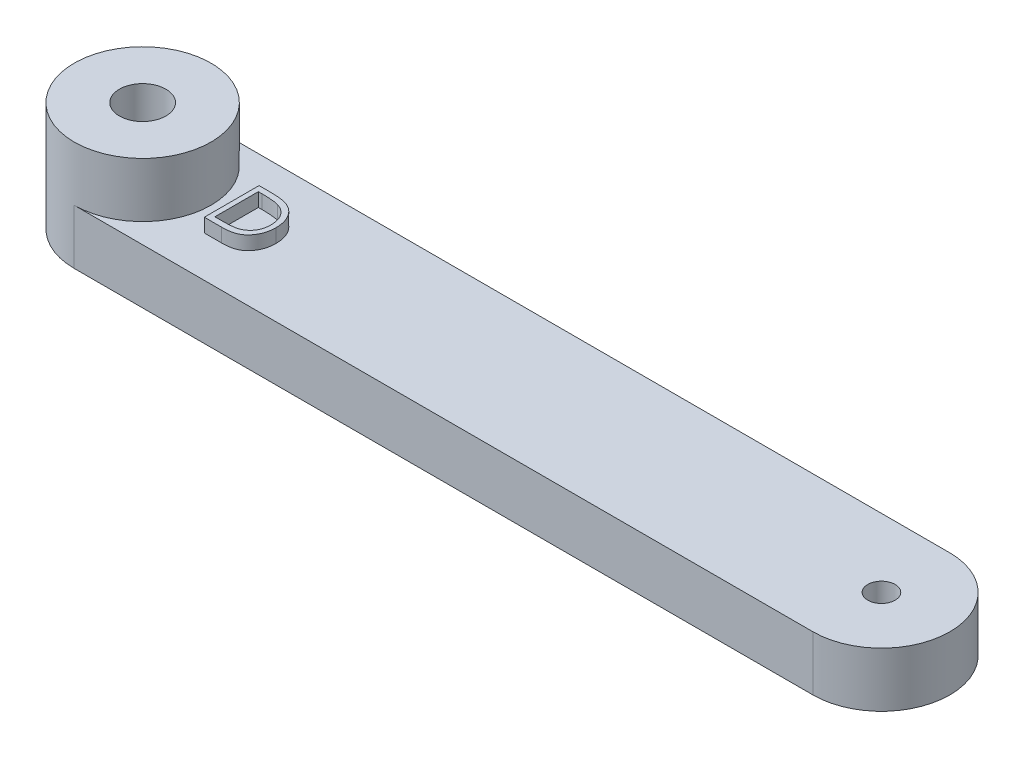
ISO-10303-21;
HEADER;
FILE_DESCRIPTION(('STEP AP214'),'2;1');
FILE_NAME('part.step','',(''),(''),'','','');
FILE_SCHEMA(('AUTOMOTIVE_DESIGN { 1 0 10303 214 1 1 1 1 }'));
ENDSEC;
DATA;
#1=APPLICATION_CONTEXT('core data for automotive mechanical design processes');
#2=APPLICATION_PROTOCOL_DEFINITION('international standard','automotive_design',2000,#1);
#3=PRODUCT_CONTEXT('',#1,'mechanical');
#4=PRODUCT('Part','Part','',(#3));
#5=PRODUCT_RELATED_PRODUCT_CATEGORY('part','',(#4));
#6=PRODUCT_DEFINITION_FORMATION('','',#4);
#7=PRODUCT_DEFINITION_CONTEXT('part definition',#1,'design');
#8=PRODUCT_DEFINITION('design','',#6,#7);
#9=PRODUCT_DEFINITION_SHAPE('','',#8);
#10=(LENGTH_UNIT() NAMED_UNIT(*) SI_UNIT(.MILLI.,.METRE.));
#11=(NAMED_UNIT(*) PLANE_ANGLE_UNIT() SI_UNIT($,.RADIAN.));
#12=(NAMED_UNIT(*) SI_UNIT($,.STERADIAN.) SOLID_ANGLE_UNIT());
#13=UNCERTAINTY_MEASURE_WITH_UNIT(LENGTH_MEASURE(1.E-05),#10,'distance_accuracy_value','');
#14=(GEOMETRIC_REPRESENTATION_CONTEXT(3) GLOBAL_UNCERTAINTY_ASSIGNED_CONTEXT((#13)) GLOBAL_UNIT_ASSIGNED_CONTEXT((#10,
#11,#12)) REPRESENTATION_CONTEXT('',''));
#15=CARTESIAN_POINT('',(0.,0.,0.));
#16=DIRECTION('',(0.,0.,1.));
#17=DIRECTION('',(1.,0.,0.));
#18=AXIS2_PLACEMENT_3D('',#15,#16,#17);
#19=CARTESIAN_POINT('',(-13.5,2.,0.));
#20=DIRECTION('',(0.,1.,0.));
#21=DIRECTION('',(0.,0.,1.));
#22=AXIS2_PLACEMENT_3D('',#19,#20,#21);
#23=PLANE('',#22);
#24=DIRECTION('',(-1.,0.,0.));
#25=VECTOR('',#24,1.);
#26=CARTESIAN_POINT('',(-9.62597554518803,2.,1.));
#27=LINE('',#26,#25);
#28=CARTESIAN_POINT('',(-9.62597554518803,2.,1.));
#29=VERTEX_POINT('',#28);
#30=CARTESIAN_POINT('',(-10.2457672118547,2.,1.));
#31=VERTEX_POINT('',#30);
#32=EDGE_CURVE('E170',#29,#31,#27,.T.);
#33=ORIENTED_EDGE('',*,*,#32,.T.);
#34=DIRECTION('',(0.,0.,-1.));
#35=VECTOR('',#34,1.);
#36=CARTESIAN_POINT('',(-10.2457672118547,2.,1.));
#37=LINE('',#36,#35);
#38=CARTESIAN_POINT('',(-10.2457672118547,2.,-1.));
#39=VERTEX_POINT('',#38);
#40=EDGE_CURVE('E233',#31,#39,#37,.T.);
#41=ORIENTED_EDGE('',*,*,#40,.T.);
#42=DIRECTION('',(1.,0.,0.));
#43=VECTOR('',#42,1.);
#44=CARTESIAN_POINT('',(-10.2457672118547,2.,-1.));
#45=LINE('',#44,#43);
#46=CARTESIAN_POINT('',(-9.84192105800855,2.,-1.));
#47=VERTEX_POINT('',#46);
#48=EDGE_CURVE('E235',#39,#47,#45,.T.);
#49=ORIENTED_EDGE('',*,*,#48,.T.);
#50=CARTESIAN_POINT('',(-9.84192105800855,2.,-1.));
#51=CARTESIAN_POINT('',(-9.80679592189064,2.,-0.999747102859448));
#52=CARTESIAN_POINT('',(-9.7389343417101,2.,-0.999258506900037));
#53=CARTESIAN_POINT('',(-9.64087008602581,2.,-0.996160569105118));
#54=CARTESIAN_POINT('',(-9.55013650747152,2.,-0.990680302906188));
#55=CARTESIAN_POINT('',(-9.46703201656749,2.,-0.982697716543552));
#56=CARTESIAN_POINT('',(-9.39132846686035,2.,-0.972895983045651));
#57=CARTESIAN_POINT('',(-9.32323783365229,2.,-0.960610037706024));
#58=CARTESIAN_POINT('',(-9.26240803770877,2.,-0.946102511771906));
#59=CARTESIAN_POINT('',(-9.22499692880064,2.,-0.933733683060342));
#60=CARTESIAN_POINT('',(-9.20730567339316,2.,-0.927884615384616));
#61=B_SPLINE_CURVE_WITH_KNOTS('',3,(#50,#51,#52,#53,#54,#55,#56,#57,#58,#59,#60),.UNSPECIFIED.,
.F.,.F.,(4,1,1,1,1,1,1,1,4),(0.,0.164289216474763,0.317405911230492,0.458843611641019,
0.589366542305311,0.707831318778172,0.815770030699004,0.912879902902127,1.),.UNSPECIFIED.);
#62=CARTESIAN_POINT('',(-9.20730567339316,2.,-0.927884615384616));
#63=VERTEX_POINT('',#62);
#64=EDGE_CURVE('E237',#47,#63,#61,.T.);
#65=ORIENTED_EDGE('',*,*,#64,.T.);
#66=CARTESIAN_POINT('',(-9.20730567339316,2.,-0.927884615384616));
#67=CARTESIAN_POINT('',(-9.18416582236036,2.,-0.919067069302403));
#68=CARTESIAN_POINT('',(-9.138410855341,2.,-0.901631929827589));
#69=CARTESIAN_POINT('',(-9.07326392815966,2.,-0.868742614780007));
#70=CARTESIAN_POINT('',(-9.01193514932158,2.,-0.831477985208946));
#71=CARTESIAN_POINT('',(-8.95409563796557,2.,-0.789788920813036));
#72=CARTESIAN_POINT('',(-8.90106659430663,2.,-0.74249500739529));
#73=CARTESIAN_POINT('',(-8.85077636760059,2.,-0.691605244180443));
#74=CARTESIAN_POINT('',(-8.80528223971312,2.,-0.635269049772192));
#75=CARTESIAN_POINT('',(-8.76362035626733,2.,-0.574654770923905));
#76=CARTESIAN_POINT('',(-8.72605712229406,2.,-0.510476455370681));
#77=CARTESIAN_POINT('',(-8.69340617494575,2.,-0.442856393259829));
#78=CARTESIAN_POINT('',(-8.6662896073251,2.,-0.372137988654009));
#79=CARTESIAN_POINT('',(-8.64377919212713,2.,-0.298517904087709));
#80=CARTESIAN_POINT('',(-8.62603835924704,2.,-0.221834259623855));
#81=CARTESIAN_POINT('',(-8.61393439827537,2.,-0.141997764732157));
#82=CARTESIAN_POINT('',(-8.60595097549244,2.,-0.0593239422215227));
#83=CARTESIAN_POINT('',(-8.60514866045554,2.,-0.00322424866058697));
#84=CARTESIAN_POINT('',(-8.60474157082906,2.,0.0252403846153845));
#85=B_SPLINE_CURVE_WITH_KNOTS('',3,(#66,#67,#68,#69,#70,#71,#72,#73,#74,#75,#76,#77,#78,#79,#80,
#81,#82,#83,#84),.UNSPECIFIED.,.F.,.F.,(4,1,1,1,1,1,1,1,1,1,1,1,1,1,1,1,4),(0.,
0.0615449660163231,0.121694296402031,0.181154855452633,0.239875388911957,0.298701942450429,
0.357647423709202,0.417604842849367,0.478494040728291,0.540407050637133,0.602344993872804,
0.665004327923234,0.728559308823376,0.793650542026886,0.860534267590268,0.929235960561964,1.),.UNSPECIFIED.);
#86=CARTESIAN_POINT('',(-8.60474157082906,2.,0.0252403846153845));
#87=VERTEX_POINT('',#86);
#88=EDGE_CURVE('E52',#63,#87,#85,.T.);
#89=ORIENTED_EDGE('',*,*,#88,.T.);
#90=CARTESIAN_POINT('',(-8.60474157082906,2.,0.0252403846153845));
#91=CARTESIAN_POINT('',(-8.60510098081713,2.,0.0499610923220729));
#92=CARTESIAN_POINT('',(-8.60580923573793,2.,0.0986758288639557));
#93=CARTESIAN_POINT('',(-8.61216884480612,2.,0.170470626354216));
#94=CARTESIAN_POINT('',(-8.62141245626124,2.,0.240135524265344));
#95=CARTESIAN_POINT('',(-8.63572342645385,2.,0.307338781432618));
#96=CARTESIAN_POINT('',(-8.65309629127511,2.,0.372669191652935));
#97=CARTESIAN_POINT('',(-8.67536152058552,2.,0.435430474135825));
#98=CARTESIAN_POINT('',(-8.70086751840037,2.,0.496198365183029));
#99=CARTESIAN_POINT('',(-8.73061030614751,2.,0.554151208559299));
#100=CARTESIAN_POINT('',(-8.76326252615143,2.,0.609055992751498));
#101=CARTESIAN_POINT('',(-8.79830352226533,2.,0.660813437390971));
#102=CARTESIAN_POINT('',(-8.83569591963435,2.,0.708684992711701));
#103=CARTESIAN_POINT('',(-8.87579628129673,2.,0.752815628161506));
#104=CARTESIAN_POINT('',(-8.91808640498204,2.,0.793138815815173));
#105=CARTESIAN_POINT('',(-8.96284316530627,2.,0.829991396013534));
#106=CARTESIAN_POINT('',(-9.01018205146277,2.,0.862652284498135));
#107=CARTESIAN_POINT('',(-9.05989103589715,2.,0.892404917765491));
#108=CARTESIAN_POINT('',(-9.11342025258211,2.,0.91835940663307));
#109=CARTESIAN_POINT('',(-9.17178360469183,2.,0.940319412235142));
#110=CARTESIAN_POINT('',(-9.23522999211019,2.,0.958517478161459));
#111=CARTESIAN_POINT('',(-9.30360368177924,2.,0.973700847187758));
#112=CARTESIAN_POINT('',(-9.37702281191657,2.,0.985745020127717));
#113=CARTESIAN_POINT('',(-9.45555936381615,2.,0.993817244377839));
#114=CARTESIAN_POINT('',(-9.53909267221007,2.,0.999276063059734));
#115=CARTESIAN_POINT('',(-9.59645225234769,2.,0.999754002123171));
#116=CARTESIAN_POINT('',(-9.62597554518803,2.,1.));
#117=B_SPLINE_CURVE_WITH_KNOTS('',3,(#90,#91,#92,#93,#94,#95,#96,#97,#98,#99,#100,#101,#102,
#103,#104,#105,#106,#107,#108,#109,#110,#111,#112,#113,#114,#115,#116),.UNSPECIFIED.,.F.,.F.,(4,
1,1,1,1,1,1,1,1,1,1,1,1,1,1,1,1,1,1,1,1,1,1,1,4),(0.,0.0460806833872481,0.0908067996076164,
0.13429527052907,0.177024385666245,0.218822733682656,0.260244116327374,0.301079867113445,
0.341613894285158,0.381583418551746,0.420119591329617,0.458074618542314,0.494738487607657,
0.531194622893714,0.566933698450378,0.602712650737996,0.638326606128436,0.674853248854825,
0.71346737078406,0.754441803848381,0.7978153607125,0.843989456208111,0.893071569879649,
0.944963346178145,1.),.UNSPECIFIED.);
#118=EDGE_CURVE('E47',#87,#29,#117,.T.);
#119=ORIENTED_EDGE('',*,*,#118,.T.);
#120=EDGE_LOOP('',(#33,#41,#49,#65,#89,#119));
#121=FACE_BOUND('',#120,.T.);
#122=CARTESIAN_POINT('',(13.5,2.,0.));
#123=DIRECTION('',(0.,1.,0.));
#124=DIRECTION('',(0.,0.,1.));
#125=AXIS2_PLACEMENT_3D('',#122,#123,#124);
#126=CIRCLE('',#125,0.500000000000001);
#127=CARTESIAN_POINT('',(13.5,2.,0.500000000000001));
#128=VERTEX_POINT('',#127);
#129=EDGE_CURVE('E259',#128,#128,#126,.T.);
#130=ORIENTED_EDGE('',*,*,#129,.F.);
#131=EDGE_LOOP('',(#130));
#132=FACE_BOUND('',#131,.T.);
#133=CARTESIAN_POINT('',(-13.5,2.,0.));
#134=DIRECTION('',(0.,1.,0.));
#135=DIRECTION('',(0.,0.,1.));
#136=AXIS2_PLACEMENT_3D('',#133,#134,#135);
#137=CIRCLE('',#136,2.5);
#138=CARTESIAN_POINT('',(-13.5,2.,2.5));
#139=VERTEX_POINT('',#138);
#140=CARTESIAN_POINT('',(-13.5,2.,-2.5));
#141=VERTEX_POINT('',#140);
#142=EDGE_CURVE('E282',#139,#141,#137,.T.);
#143=ORIENTED_EDGE('',*,*,#142,.F.);
#144=DIRECTION('',(1.,0.,0.));
#145=VECTOR('',#144,1.);
#146=CARTESIAN_POINT('',(-13.5,2.,2.5));
#147=LINE('',#146,#145);
#148=CARTESIAN_POINT('',(13.5,2.,2.5));
#149=VERTEX_POINT('',#148);
#150=EDGE_CURVE('E291',#139,#149,#147,.T.);
#151=ORIENTED_EDGE('',*,*,#150,.T.);
#152=CARTESIAN_POINT('',(13.5,2.,0.));
#153=DIRECTION('',(0.,1.,0.));
#154=DIRECTION('',(0.,0.,1.));
#155=AXIS2_PLACEMENT_3D('',#152,#153,#154);
#156=CIRCLE('',#155,2.5);
#157=CARTESIAN_POINT('',(13.5,2.,-2.5));
#158=VERTEX_POINT('',#157);
#159=EDGE_CURVE('E293',#149,#158,#156,.T.);
#160=ORIENTED_EDGE('',*,*,#159,.T.);
#161=DIRECTION('',(-1.,0.,0.));
#162=VECTOR('',#161,1.);
#163=CARTESIAN_POINT('',(-13.5,2.,-2.5));
#164=LINE('',#163,#162);
#165=EDGE_CURVE('E296',#158,#141,#164,.T.);
#166=ORIENTED_EDGE('',*,*,#165,.T.);
#167=EDGE_LOOP('',(#143,#151,#160,#166));
#168=FACE_BOUND('',#167,.T.);
#169=ADVANCED_FACE('F32',(#121,#132,#168),#23,.T.);
#170=CARTESIAN_POINT('',(-13.5,2.,0.));
#171=DIRECTION('',(0.,-1.,0.));
#172=DIRECTION('',(0.,0.,-1.));
#173=AXIS2_PLACEMENT_3D('',#170,#171,#172);
#174=CYLINDRICAL_SURFACE('',#173,2.5);
#175=CARTESIAN_POINT('',(-13.5,0.,0.));
#176=DIRECTION('',(0.,1.,0.));
#177=DIRECTION('',(0.,0.,1.));
#178=AXIS2_PLACEMENT_3D('',#175,#176,#177);
#179=CIRCLE('',#178,2.5);
#180=CARTESIAN_POINT('',(-13.5,0.,-2.5));
#181=VERTEX_POINT('',#180);
#182=CARTESIAN_POINT('',(-13.5,0.,2.5));
#183=VERTEX_POINT('',#182);
#184=EDGE_CURVE('E288',#181,#183,#179,.T.);
#185=ORIENTED_EDGE('',*,*,#184,.T.);
#186=DIRECTION('',(0.,-1.,0.));
#187=VECTOR('',#186,1.);
#188=CARTESIAN_POINT('',(-13.5,2.,2.5));
#189=LINE('',#188,#187);
#190=EDGE_CURVE('E11',#139,#183,#189,.T.);
#191=ORIENTED_EDGE('',*,*,#190,.F.);
#192=ORIENTED_EDGE('',*,*,#142,.T.);
#193=DIRECTION('',(0.,-1.,0.));
#194=VECTOR('',#193,1.);
#195=CARTESIAN_POINT('',(-13.5,2.,-2.5));
#196=LINE('',#195,#194);
#197=EDGE_CURVE('E298',#141,#181,#196,.T.);
#198=ORIENTED_EDGE('',*,*,#197,.T.);
#199=EDGE_LOOP('',(#185,#191,#192,#198));
#200=FACE_BOUND('',#199,.T.);
#201=CARTESIAN_POINT('',(-13.5,4.,0.));
#202=DIRECTION('',(0.,1.,0.));
#203=DIRECTION('',(0.,0.,1.));
#204=AXIS2_PLACEMENT_3D('',#201,#202,#203);
#205=CIRCLE('',#204,2.5);
#206=CARTESIAN_POINT('',(-13.5,4.,2.5));
#207=VERTEX_POINT('',#206);
#208=EDGE_CURVE('E285',#207,#207,#205,.T.);
#209=ORIENTED_EDGE('',*,*,#208,.F.);
#210=EDGE_LOOP('',(#209));
#211=FACE_BOUND('',#210,.T.);
#212=ADVANCED_FACE('F34',(#200,#211),#174,.T.);
#213=CARTESIAN_POINT('',(-13.5,2.,2.5));
#214=DIRECTION('',(0.,0.,-1.));
#215=DIRECTION('',(-1.,0.,0.));
#216=AXIS2_PLACEMENT_3D('',#213,#214,#215);
#217=PLANE('',#216);
#218=DIRECTION('',(1.,0.,0.));
#219=VECTOR('',#218,1.);
#220=CARTESIAN_POINT('',(-13.5,0.,2.5));
#221=LINE('',#220,#219);
#222=CARTESIAN_POINT('',(13.5,0.,2.5));
#223=VERTEX_POINT('',#222);
#224=EDGE_CURVE('E301',#183,#223,#221,.T.);
#225=ORIENTED_EDGE('',*,*,#224,.T.);
#226=DIRECTION('',(0.,-1.,0.));
#227=VECTOR('',#226,1.);
#228=CARTESIAN_POINT('',(13.5,2.,2.5));
#229=LINE('',#228,#227);
#230=EDGE_CURVE('E40',#149,#223,#229,.T.);
#231=ORIENTED_EDGE('',*,*,#230,.F.);
#232=ORIENTED_EDGE('',*,*,#150,.F.);
#233=ORIENTED_EDGE('',*,*,#190,.T.);
#234=EDGE_LOOP('',(#225,#231,#232,#233));
#235=FACE_BOUND('',#234,.T.);
#236=ADVANCED_FACE('F331',(#235),#217,.F.);
#237=CARTESIAN_POINT('',(13.5,2.,0.));
#238=DIRECTION('',(0.,-1.,0.));
#239=DIRECTION('',(0.,0.,-1.));
#240=AXIS2_PLACEMENT_3D('',#237,#238,#239);
#241=CYLINDRICAL_SURFACE('',#240,2.5);
#242=CARTESIAN_POINT('',(13.5,0.,0.));
#243=DIRECTION('',(0.,1.,0.));
#244=DIRECTION('',(0.,0.,1.));
#245=AXIS2_PLACEMENT_3D('',#242,#243,#244);
#246=CIRCLE('',#245,2.5);
#247=CARTESIAN_POINT('',(13.5,0.,-2.5));
#248=VERTEX_POINT('',#247);
#249=EDGE_CURVE('E303',#223,#248,#246,.T.);
#250=ORIENTED_EDGE('',*,*,#249,.T.);
#251=DIRECTION('',(0.,-1.,0.));
#252=VECTOR('',#251,1.);
#253=CARTESIAN_POINT('',(13.5,2.,-2.5));
#254=LINE('',#253,#252);
#255=EDGE_CURVE('E308',#158,#248,#254,.T.);
#256=ORIENTED_EDGE('',*,*,#255,.F.);
#257=ORIENTED_EDGE('',*,*,#159,.F.);
#258=ORIENTED_EDGE('',*,*,#230,.T.);
#259=EDGE_LOOP('',(#250,#256,#257,#258));
#260=FACE_BOUND('',#259,.T.);
#261=ADVANCED_FACE('F315',(#260),#241,.T.);
#262=CARTESIAN_POINT('',(-13.5,2.,-2.5));
#263=DIRECTION('',(0.,0.,1.));
#264=DIRECTION('',(1.,0.,0.));
#265=AXIS2_PLACEMENT_3D('',#262,#263,#264);
#266=PLANE('',#265);
#267=DIRECTION('',(-1.,0.,0.));
#268=VECTOR('',#267,1.);
#269=CARTESIAN_POINT('',(-13.5,0.,-2.5));
#270=LINE('',#269,#268);
#271=EDGE_CURVE('E294',#248,#181,#270,.T.);
#272=ORIENTED_EDGE('',*,*,#271,.T.);
#273=ORIENTED_EDGE('',*,*,#197,.F.);
#274=ORIENTED_EDGE('',*,*,#165,.F.);
#275=ORIENTED_EDGE('',*,*,#255,.T.);
#276=EDGE_LOOP('',(#272,#273,#274,#275));
#277=FACE_BOUND('',#276,.T.);
#278=ADVANCED_FACE('F325',(#277),#266,.F.);
#279=CARTESIAN_POINT('',(-13.5,0.,0.));
#280=DIRECTION('',(0.,1.,0.));
#281=DIRECTION('',(0.,0.,1.));
#282=AXIS2_PLACEMENT_3D('',#279,#280,#281);
#283=PLANE('',#282);
#284=CARTESIAN_POINT('',(13.5,0.,0.));
#285=DIRECTION('',(0.,1.,0.));
#286=DIRECTION('',(0.,0.,1.));
#287=AXIS2_PLACEMENT_3D('',#284,#285,#286);
#288=CIRCLE('',#287,0.500000000000001);
#289=CARTESIAN_POINT('',(13.5,0.,0.500000000000001));
#290=VERTEX_POINT('',#289);
#291=EDGE_CURVE('E275',#290,#290,#288,.F.);
#292=ORIENTED_EDGE('',*,*,#291,.F.);
#293=EDGE_LOOP('',(#292));
#294=FACE_BOUND('',#293,.T.);
#295=CARTESIAN_POINT('',(-13.5,0.,0.));
#296=DIRECTION('',(0.,1.,0.));
#297=DIRECTION('',(0.,0.,1.));
#298=AXIS2_PLACEMENT_3D('',#295,#296,#297);
#299=CIRCLE('',#298,0.85);
#300=CARTESIAN_POINT('',(-13.5,0.,0.85));
#301=VERTEX_POINT('',#300);
#302=EDGE_CURVE('E279',#301,#301,#299,.T.);
#303=ORIENTED_EDGE('',*,*,#302,.T.);
#304=EDGE_LOOP('',(#303));
#305=FACE_BOUND('',#304,.T.);
#306=ORIENTED_EDGE('',*,*,#184,.F.);
#307=ORIENTED_EDGE('',*,*,#271,.F.);
#308=ORIENTED_EDGE('',*,*,#249,.F.);
#309=ORIENTED_EDGE('',*,*,#224,.F.);
#310=EDGE_LOOP('',(#306,#307,#308,#309));
#311=FACE_BOUND('',#310,.T.);
#312=ADVANCED_FACE('F322',(#294,#305,#311),#283,.F.);
#313=CARTESIAN_POINT('',(-13.5,4.,0.));
#314=DIRECTION('',(0.,1.,0.));
#315=DIRECTION('',(0.,0.,1.));
#316=AXIS2_PLACEMENT_3D('',#313,#314,#315);
#317=PLANE('',#316);
#318=CARTESIAN_POINT('',(-13.5,4.,0.));
#319=DIRECTION('',(0.,1.,0.));
#320=DIRECTION('',(0.,0.,1.));
#321=AXIS2_PLACEMENT_3D('',#318,#319,#320);
#322=CIRCLE('',#321,0.85);
#323=CARTESIAN_POINT('',(-13.5,4.,0.85));
#324=VERTEX_POINT('',#323);
#325=EDGE_CURVE('E278',#324,#324,#322,.T.);
#326=ORIENTED_EDGE('',*,*,#325,.F.);
#327=EDGE_LOOP('',(#326));
#328=FACE_BOUND('',#327,.T.);
#329=ORIENTED_EDGE('',*,*,#208,.T.);
#330=EDGE_LOOP('',(#329));
#331=FACE_BOUND('',#330,.T.);
#332=ADVANCED_FACE('F440',(#328,#331),#317,.T.);
#333=CARTESIAN_POINT('',(-13.5,0.,0.));
#334=DIRECTION('',(0.,1.,0.));
#335=DIRECTION('',(0.,0.,1.));
#336=AXIS2_PLACEMENT_3D('',#333,#334,#335);
#337=CYLINDRICAL_SURFACE('',#336,0.85);
#338=ORIENTED_EDGE('',*,*,#302,.F.);
#339=EDGE_LOOP('',(#338));
#340=FACE_BOUND('',#339,.T.);
#341=ORIENTED_EDGE('',*,*,#325,.T.);
#342=EDGE_LOOP('',(#341));
#343=FACE_BOUND('',#342,.T.);
#344=ADVANCED_FACE('F437',(#340,#343),#337,.F.);
#345=CARTESIAN_POINT('',(13.5,-0.00100000000000013,0.));
#346=DIRECTION('',(0.,1.,0.));
#347=DIRECTION('',(0.,0.,1.));
#348=AXIS2_PLACEMENT_3D('',#345,#346,#347);
#349=CYLINDRICAL_SURFACE('',#348,0.500000000000001);
#350=ORIENTED_EDGE('',*,*,#129,.T.);
#351=EDGE_LOOP('',(#350));
#352=FACE_BOUND('',#351,.T.);
#353=ORIENTED_EDGE('',*,*,#291,.T.);
#354=EDGE_LOOP('',(#353));
#355=FACE_BOUND('',#354,.T.);
#356=ADVANCED_FACE('F207',(#352,#355),#349,.F.);
#357=CARTESIAN_POINT('',(-9.52154564852681,2.5,-0.987765785225365));
#358=DIRECTION('',(0.,1.,-1.21912365033344E-12));
#359=DIRECTION('',(0.,1.21912365033344E-12,1.));
#360=AXIS2_PLACEMENT_3D('',#357,#358,#359);
#361=PLANE('',#360);
#362=DIRECTION('',(-1.,0.,0.));
#363=VECTOR('',#362,1.);
#364=CARTESIAN_POINT('',(-9.62597554518803,2.5,1.));
#365=LINE('',#364,#363);
#366=CARTESIAN_POINT('',(-9.62597554518803,2.5,1.));
#367=VERTEX_POINT('',#366);
#368=CARTESIAN_POINT('',(-10.2457672118547,2.5,1.));
#369=VERTEX_POINT('',#368);
#370=EDGE_CURVE('E253',#367,#369,#365,.T.);
#371=ORIENTED_EDGE('',*,*,#370,.F.);
#372=CARTESIAN_POINT('',(-8.60474157082906,2.5,0.0252403846153845));
#373=CARTESIAN_POINT('',(-8.60510098081713,2.5,0.0499610923220729));
#374=CARTESIAN_POINT('',(-8.60580923573793,2.5,0.0986758288639557));
#375=CARTESIAN_POINT('',(-8.61216884480612,2.5,0.170470626354216));
#376=CARTESIAN_POINT('',(-8.62141245626124,2.5,0.240135524265344));
#377=CARTESIAN_POINT('',(-8.63572342645385,2.5,0.307338781432618));
#378=CARTESIAN_POINT('',(-8.65309629127511,2.5,0.372669191652935));
#379=CARTESIAN_POINT('',(-8.67536152058552,2.5,0.435430474135825));
#380=CARTESIAN_POINT('',(-8.70086751840037,2.5,0.496198365183029));
#381=CARTESIAN_POINT('',(-8.73061030614751,2.5,0.554151208559299));
#382=CARTESIAN_POINT('',(-8.76326252615143,2.5,0.609055992751498));
#383=CARTESIAN_POINT('',(-8.79830352226533,2.5,0.660813437390971));
#384=CARTESIAN_POINT('',(-8.83569591963435,2.5,0.708684992711701));
#385=CARTESIAN_POINT('',(-8.87579628129673,2.5,0.752815628161506));
#386=CARTESIAN_POINT('',(-8.91808640498204,2.5,0.793138815815173));
#387=CARTESIAN_POINT('',(-8.96284316530627,2.5,0.829991396013534));
#388=CARTESIAN_POINT('',(-9.01018205146277,2.5,0.862652284498135));
#389=CARTESIAN_POINT('',(-9.05989103589715,2.5,0.892404917765491));
#390=CARTESIAN_POINT('',(-9.11342025258211,2.5,0.91835940663307));
#391=CARTESIAN_POINT('',(-9.17178360469183,2.5,0.940319412235142));
#392=CARTESIAN_POINT('',(-9.23522999211019,2.5,0.958517478161459));
#393=CARTESIAN_POINT('',(-9.30360368177924,2.5,0.973700847187758));
#394=CARTESIAN_POINT('',(-9.37702281191657,2.5,0.985745020127717));
#395=CARTESIAN_POINT('',(-9.45555936381615,2.5,0.993817244377839));
#396=CARTESIAN_POINT('',(-9.53909267221007,2.5,0.999276063059734));
#397=CARTESIAN_POINT('',(-9.59645225234769,2.5,0.999754002123171));
#398=CARTESIAN_POINT('',(-9.62597554518803,2.5,1.));
#399=B_SPLINE_CURVE_WITH_KNOTS('',3,(#372,#373,#374,#375,#376,#377,#378,#379,#380,#381,#382,
#383,#384,#385,#386,#387,#388,#389,#390,#391,#392,#393,#394,#395,#396,#397,#398),.UNSPECIFIED.,
.F.,.F.,(4,1,1,1,1,1,1,1,1,1,1,1,1,1,1,1,1,1,1,1,1,1,1,1,4),(0.,0.0460806833872481,
0.0908067996076164,0.13429527052907,0.177024385666245,0.218822733682656,0.260244116327374,
0.301079867113445,0.341613894285158,0.381583418551746,0.420119591329617,0.458074618542314,
0.494738487607657,0.531194622893714,0.566933698450378,0.602712650737996,0.638326606128436,
0.674853248854825,0.71346737078406,0.754441803848381,0.7978153607125,0.843989456208111,
0.893071569879649,0.944963346178145,1.),.UNSPECIFIED.);
#400=CARTESIAN_POINT('',(-8.60474157082906,2.5,0.0252403846153845));
#401=VERTEX_POINT('',#400);
#402=EDGE_CURVE('E217',#401,#367,#399,.T.);
#403=ORIENTED_EDGE('',*,*,#402,.F.);
#404=CARTESIAN_POINT('',(-9.20730567339316,2.5,-0.927884615384616));
#405=CARTESIAN_POINT('',(-9.18416582236036,2.5,-0.919067069302403));
#406=CARTESIAN_POINT('',(-9.138410855341,2.5,-0.901631929827589));
#407=CARTESIAN_POINT('',(-9.07326392815966,2.5,-0.868742614780007));
#408=CARTESIAN_POINT('',(-9.01193514932158,2.5,-0.831477985208946));
#409=CARTESIAN_POINT('',(-8.95409563796557,2.5,-0.789788920813036));
#410=CARTESIAN_POINT('',(-8.90106659430663,2.5,-0.74249500739529));
#411=CARTESIAN_POINT('',(-8.85077636760059,2.5,-0.691605244180443));
#412=CARTESIAN_POINT('',(-8.80528223971312,2.5,-0.635269049772192));
#413=CARTESIAN_POINT('',(-8.76362035626733,2.5,-0.574654770923905));
#414=CARTESIAN_POINT('',(-8.72605712229406,2.5,-0.510476455370681));
#415=CARTESIAN_POINT('',(-8.69340617494575,2.5,-0.442856393259829));
#416=CARTESIAN_POINT('',(-8.6662896073251,2.5,-0.372137988654009));
#417=CARTESIAN_POINT('',(-8.64377919212713,2.5,-0.298517904087709));
#418=CARTESIAN_POINT('',(-8.62603835924704,2.5,-0.221834259623855));
#419=CARTESIAN_POINT('',(-8.61393439827537,2.5,-0.141997764732157));
#420=CARTESIAN_POINT('',(-8.60595097549244,2.5,-0.0593239422215227));
#421=CARTESIAN_POINT('',(-8.60514866045554,2.5,-0.00322424866058697));
#422=CARTESIAN_POINT('',(-8.60474157082906,2.5,0.0252403846153845));
#423=B_SPLINE_CURVE_WITH_KNOTS('',3,(#404,#405,#406,#407,#408,#409,#410,#411,#412,#413,#414,
#415,#416,#417,#418,#419,#420,#421,#422),.UNSPECIFIED.,.F.,.F.,(4,1,1,1,1,1,1,1,1,1,1,1,1,1,1,1,
4),(0.,0.0615449660163231,0.121694296402031,0.181154855452633,0.239875388911957,
0.298701942450429,0.357647423709202,0.417604842849367,0.478494040728291,0.540407050637133,
0.602344993872804,0.665004327923234,0.728559308823376,0.793650542026886,0.860534267590268,
0.929235960561964,1.),.UNSPECIFIED.);
#424=CARTESIAN_POINT('',(-9.20730567339316,2.5,-0.927884615384616));
#425=VERTEX_POINT('',#424);
#426=EDGE_CURVE('E224',#425,#401,#423,.T.);
#427=ORIENTED_EDGE('',*,*,#426,.F.);
#428=CARTESIAN_POINT('',(-9.84192105800855,2.5,-1.));
#429=CARTESIAN_POINT('',(-9.80679592189064,2.5,-0.999747102859448));
#430=CARTESIAN_POINT('',(-9.7389343417101,2.5,-0.999258506900037));
#431=CARTESIAN_POINT('',(-9.64087008602581,2.5,-0.996160569105118));
#432=CARTESIAN_POINT('',(-9.55013650747152,2.5,-0.990680302906188));
#433=CARTESIAN_POINT('',(-9.46703201656749,2.5,-0.982697716543552));
#434=CARTESIAN_POINT('',(-9.39132846686035,2.5,-0.972895983045651));
#435=CARTESIAN_POINT('',(-9.32323783365229,2.5,-0.960610037706024));
#436=CARTESIAN_POINT('',(-9.26240803770877,2.5,-0.946102511771906));
#437=CARTESIAN_POINT('',(-9.22499692880064,2.5,-0.933733683060342));
#438=CARTESIAN_POINT('',(-9.20730567339316,2.5,-0.927884615384616));
#439=B_SPLINE_CURVE_WITH_KNOTS('',3,(#428,#429,#430,#431,#432,#433,#434,#435,#436,#437,#438),
.UNSPECIFIED.,.F.,.F.,(4,1,1,1,1,1,1,1,4),(0.,0.164289216474763,0.317405911230492,
0.458843611641019,0.589366542305311,0.707831318778172,0.815770030699004,0.912879902902127,1.),.UNSPECIFIED.);
#440=CARTESIAN_POINT('',(-9.84192105800855,2.5,-1.));
#441=VERTEX_POINT('',#440);
#442=EDGE_CURVE('E413',#441,#425,#439,.T.);
#443=ORIENTED_EDGE('',*,*,#442,.F.);
#444=DIRECTION('',(1.,0.,0.));
#445=VECTOR('',#444,1.);
#446=CARTESIAN_POINT('',(-10.2457672118547,2.5,-1.));
#447=LINE('',#446,#445);
#448=CARTESIAN_POINT('',(-10.2457672118547,2.5,-1.));
#449=VERTEX_POINT('',#448);
#450=EDGE_CURVE('E411',#449,#441,#447,.T.);
#451=ORIENTED_EDGE('',*,*,#450,.F.);
#452=DIRECTION('',(0.,0.,-1.));
#453=VECTOR('',#452,1.);
#454=CARTESIAN_POINT('',(-10.2457672118547,2.5,1.));
#455=LINE('',#454,#453);
#456=EDGE_CURVE('E408',#369,#449,#455,.T.);
#457=ORIENTED_EDGE('',*,*,#456,.F.);
#458=EDGE_LOOP('',(#371,#403,#427,#443,#451,#457));
#459=FACE_BOUND('',#458,.T.);
#460=DIRECTION('',(1.,0.,0.));
#461=VECTOR('',#460,1.);
#462=CARTESIAN_POINT('',(-10.0662800323675,2.5,0.794871794871795));
#463=LINE('',#462,#461);
#464=CARTESIAN_POINT('',(-10.0662800323675,2.5,0.794871794871795));
#465=VERTEX_POINT('',#464);
#466=CARTESIAN_POINT('',(-9.83671272467521,2.5,0.794871794871795));
#467=VERTEX_POINT('',#466);
#468=EDGE_CURVE('E161',#465,#467,#463,.T.);
#469=ORIENTED_EDGE('',*,*,#468,.F.);
#470=DIRECTION('',(0.,0.,1.));
#471=VECTOR('',#470,1.);
#472=CARTESIAN_POINT('',(-10.0662800323675,2.5,-0.794871794871795));
#473=LINE('',#472,#471);
#474=CARTESIAN_POINT('',(-10.0662800323675,2.5,-0.794871794871795));
#475=VERTEX_POINT('',#474);
#476=EDGE_CURVE('E151',#475,#465,#473,.T.);
#477=ORIENTED_EDGE('',*,*,#476,.F.);
#478=DIRECTION('',(-1.,0.,0.));
#479=VECTOR('',#478,1.);
#480=CARTESIAN_POINT('',(-9.92565503236752,2.5,-0.794871794871795));
#481=LINE('',#480,#479);
#482=CARTESIAN_POINT('',(-9.92565503236752,2.50000000000024,-0.794871794871795));
#483=VERTEX_POINT('',#482);
#484=EDGE_CURVE('E361',#483,#475,#481,.T.);
#485=ORIENTED_EDGE('',*,*,#484,.F.);
#486=CARTESIAN_POINT('',(-9.31107169903419,2.5,-0.738782051282051));
#487=CARTESIAN_POINT('',(-9.32784378267514,2.5,-0.743420010065661));
#488=CARTESIAN_POINT('',(-9.36350583426454,2.5,-0.753281582959723));
#489=CARTESIAN_POINT('',(-9.42169981370768,2.5,-0.764038938686372));
#490=CARTESIAN_POINT('',(-9.4871941848102,2.5,-0.773527223838859));
#491=CARTESIAN_POINT('',(-9.56027972830374,2.5,-0.781560389180146));
#492=CARTESIAN_POINT('',(-9.64087313350126,2.5,-0.787324572804132));
#493=CARTESIAN_POINT('',(-9.72903638377864,2.5,-0.791651038294054));
#494=CARTESIAN_POINT('',(-9.82480758638872,2.5,-0.79456911399827));
#495=CARTESIAN_POINT('',(-9.89119760573332,2.5,-0.794768375257229));
#496=CARTESIAN_POINT('',(-9.92565503236752,2.5,-0.794871794871795));
#497=B_SPLINE_CURVE_WITH_KNOTS('',3,(#486,#487,#488,#489,#490,#491,#492,#493,#494,#495,#496),
.UNSPECIFIED.,.F.,.F.,(4,1,1,1,1,1,1,1,4),(0.,0.0843186169585826,0.179284514213904,
0.286582527646561,0.405111483434279,0.535592873418972,0.678190209993412,0.832975839760486,1.),.UNSPECIFIED.);
#498=CARTESIAN_POINT('',(-9.31107169903419,2.5,-0.738782051282051));
#499=VERTEX_POINT('',#498);
#500=EDGE_CURVE('E605',#499,#483,#497,.T.);
#501=ORIENTED_EDGE('',*,*,#500,.F.);
#502=CARTESIAN_POINT('',(-8.78422875031624,2.5,0.0248397435897435));
#503=CARTESIAN_POINT('',(-8.78452205738138,2.5,0.00144918341971956));
#504=CARTESIAN_POINT('',(-8.78509826170706,2.5,-0.0445017790759705));
#505=CARTESIAN_POINT('',(-8.7923407248056,2.5,-0.111925033517532));
#506=CARTESIAN_POINT('',(-8.80292447080525,2.5,-0.176771119531944));
#507=CARTESIAN_POINT('',(-8.81822943425595,2.5,-0.239044374042575));
#508=CARTESIAN_POINT('',(-8.83773279359619,2.5,-0.298866289571309));
#509=CARTESIAN_POINT('',(-8.86207258888544,2.5,-0.355906009683441));
#510=CARTESIAN_POINT('',(-8.88988208561016,2.5,-0.410765934753637));
#511=CARTESIAN_POINT('',(-8.92296970666389,2.5,-0.462179858030099));
#512=CARTESIAN_POINT('',(-8.95920718858426,2.5,-0.510804491818319));
#513=CARTESIAN_POINT('',(-8.99942311963241,2.5,-0.555350157866318));
#514=CARTESIAN_POINT('',(-9.04297857022021,2.5,-0.595918329453491));
#515=CARTESIAN_POINT('',(-9.08939848419424,2.5,-0.633140793831054));
#516=CARTESIAN_POINT('',(-9.13999111233577,2.5,-0.66552003719602));
#517=CARTESIAN_POINT('',(-9.19356464993014,2.5,-0.694483854957257));
#518=CARTESIAN_POINT('',(-9.25090503346378,2.5,-0.719064364293699));
#519=CARTESIAN_POINT('',(-9.29079800251529,2.5,-0.732138000157286));
#520=CARTESIAN_POINT('',(-9.31107169903419,2.5,-0.738782051282051));
#521=B_SPLINE_CURVE_WITH_KNOTS('',3,(#502,#503,#504,#505,#506,#507,#508,#509,#510,#511,#512,
#513,#514,#515,#516,#517,#518,#519,#520),.UNSPECIFIED.,.F.,.F.,(4,1,1,1,1,1,1,1,1,1,1,1,1,1,1,1,
4),(0.,0.0701511759972785,0.137812606190192,0.203226247181394,0.267174055294474,
0.330024003408179,0.391794271786686,0.45308439899714,0.514333907645877,0.574999992818269,
0.634865482622213,0.694116315189642,0.753441621780438,0.813125800303611,0.874079685637075,
0.936007013274407,1.),.UNSPECIFIED.);
#522=CARTESIAN_POINT('',(-8.78422875031624,2.5,0.0248397435897435));
#523=VERTEX_POINT('',#522);
#524=EDGE_CURVE('E610',#523,#499,#521,.T.);
#525=ORIENTED_EDGE('',*,*,#524,.F.);
#526=CARTESIAN_POINT('',(-9.26499798108547,2.5,0.743990384615385));
#527=CARTESIAN_POINT('',(-9.24674177418428,2.5,0.737560922762393));
#528=CARTESIAN_POINT('',(-9.21066540950772,2.5,0.724855566620342));
#529=CARTESIAN_POINT('',(-9.15873336081955,2.5,0.701679760227467));
#530=CARTESIAN_POINT('',(-9.1103007867294,2.5,0.67422714894201));
#531=CARTESIAN_POINT('',(-9.06452362942303,2.5,0.643711563808808));
#532=CARTESIAN_POINT('',(-9.022051254891,2.5,0.60905670551342));
#533=CARTESIAN_POINT('',(-8.9823803312868,2.5,0.571016140482581));
#534=CARTESIAN_POINT('',(-8.94559073050959,2.5,0.529396269012982));
#535=CARTESIAN_POINT('',(-8.9120625545148,2.5,0.484248748119923));
#536=CARTESIAN_POINT('',(-8.88205780935292,2.5,0.435854579182533));
#537=CARTESIAN_POINT('',(-8.85607424969071,2.5,0.384689531369917));
#538=CARTESIAN_POINT('',(-8.83330194592419,2.5,0.331314211244254));
#539=CARTESIAN_POINT('',(-8.81542846442923,2.5,0.274908977727867));
#540=CARTESIAN_POINT('',(-8.80141955918731,2.5,0.215978087204452));
#541=CARTESIAN_POINT('',(-8.79149688035315,2.5,0.154517393912098));
#542=CARTESIAN_POINT('',(-8.78531703780468,2.5,0.0905383757084095));
#543=CARTESIAN_POINT('',(-8.78459621041116,2.5,0.0470228761271644));
#544=CARTESIAN_POINT('',(-8.78422875031624,2.5,0.0248397435897435));
#545=B_SPLINE_CURVE_WITH_KNOTS('',3,(#526,#527,#528,#529,#530,#531,#532,#533,#534,#535,#536,
#537,#538,#539,#540,#541,#542,#543,#544),.UNSPECIFIED.,.F.,.F.,(4,1,1,1,1,1,1,1,1,1,1,1,1,1,1,1,
4),(0.,0.0624145002632775,0.123338231473314,0.183124537692193,0.241782994638944,
0.300578882550978,0.359680074896626,0.418881640850046,0.479530664457783,0.540850535760038,
0.60230339589838,0.664463211946473,0.727805722667012,0.792894814781235,0.859672328302831,
0.928464400733489,1.),.UNSPECIFIED.);
#546=CARTESIAN_POINT('',(-9.26499798108547,2.5,0.743990384615385));
#547=VERTEX_POINT('',#546);
#548=EDGE_CURVE('E178',#547,#523,#545,.T.);
#549=ORIENTED_EDGE('',*,*,#548,.F.);
#550=CARTESIAN_POINT('',(-9.83671272467521,2.5,0.794871794871795));
#551=CARTESIAN_POINT('',(-9.80372508425235,2.5,0.794730025515185));
#552=CARTESIAN_POINT('',(-9.74027777087359,2.5,0.794457351123169));
#553=CARTESIAN_POINT('',(-9.64904462956558,2.5,0.792064663618444));
#554=CARTESIAN_POINT('',(-9.56568497443939,2.5,0.788154985045125));
#555=CARTESIAN_POINT('',(-9.49018696907185,2.5,0.782683512011608));
#556=CARTESIAN_POINT('',(-9.42259324090195,2.5,0.775444303332557));
#557=CARTESIAN_POINT('',(-9.36276252668331,2.5,0.767372930333983));
#558=CARTESIAN_POINT('',(-9.31089095049768,2.5,0.757317244187664));
#559=CARTESIAN_POINT('',(-9.27950270081655,2.5,0.748202410236458));
#560=CARTESIAN_POINT('',(-9.26499798108547,2.5,0.743990384615385));
#561=B_SPLINE_CURVE_WITH_KNOTS('',3,(#550,#551,#552,#553,#554,#555,#556,#557,#558,#559,#560),
.UNSPECIFIED.,.F.,.F.,(4,1,1,1,1,1,1,1,4),(0.,0.171900664613271,0.330627932095882,
0.475548835880918,0.606746190312364,0.72502380346749,0.829742386958455,0.921322820343975,1.),.UNSPECIFIED.);
#562=EDGE_CURVE('E176',#467,#547,#561,.T.);
#563=ORIENTED_EDGE('',*,*,#562,.F.);
#564=EDGE_LOOP('',(#469,#477,#485,#501,#525,#549,#563));
#565=FACE_BOUND('',#564,.T.);
#566=ADVANCED_FACE('F174',(#459,#565),#361,.T.);
#567=CARTESIAN_POINT('',(-9.62597554518803,2.5,1.));
#568=DIRECTION('',(0.,0.,1.));
#569=DIRECTION('',(1.,0.,0.));
#570=AXIS2_PLACEMENT_3D('',#567,#568,#569);
#571=PLANE('',#570);
#572=ORIENTED_EDGE('',*,*,#32,.F.);
#573=DIRECTION('',(0.,-1.,0.));
#574=VECTOR('',#573,1.);
#575=CARTESIAN_POINT('',(-9.62597554518803,2.5,1.));
#576=LINE('',#575,#574);
#577=EDGE_CURVE('E254',#367,#29,#576,.T.);
#578=ORIENTED_EDGE('',*,*,#577,.F.);
#579=ORIENTED_EDGE('',*,*,#370,.T.);
#580=DIRECTION('',(0.,-1.,0.));
#581=VECTOR('',#580,1.);
#582=CARTESIAN_POINT('',(-10.2457672118547,2.5,1.));
#583=LINE('',#582,#581);
#584=EDGE_CURVE('E223',#369,#31,#583,.T.);
#585=ORIENTED_EDGE('',*,*,#584,.T.);
#586=EDGE_LOOP('',(#572,#578,#579,#585));
#587=FACE_BOUND('',#586,.T.);
#588=ADVANCED_FACE('F206',(#587),#571,.T.);
#589=DIRECTION('',(0.,-1.,0.));
#590=VECTOR('',#589,1.);
#591=SURFACE_OF_LINEAR_EXTRUSION('',#399,#590);
#592=ORIENTED_EDGE('',*,*,#118,.F.);
#593=DIRECTION('',(0.,-1.,0.));
#594=VECTOR('',#593,1.);
#595=CARTESIAN_POINT('',(-8.60474157082906,2.5,0.0252403846153845));
#596=LINE('',#595,#594);
#597=EDGE_CURVE('E260',#401,#87,#596,.T.);
#598=ORIENTED_EDGE('',*,*,#597,.F.);
#599=ORIENTED_EDGE('',*,*,#402,.T.);
#600=ORIENTED_EDGE('',*,*,#577,.T.);
#601=EDGE_LOOP('',(#592,#598,#599,#600));
#602=FACE_BOUND('',#601,.T.);
#603=ADVANCED_FACE('F209',(#602),#591,.T.);
#604=DIRECTION('',(0.,-1.,0.));
#605=VECTOR('',#604,1.);
#606=SURFACE_OF_LINEAR_EXTRUSION('',#423,#605);
#607=ORIENTED_EDGE('',*,*,#88,.F.);
#608=DIRECTION('',(0.,-1.,0.));
#609=VECTOR('',#608,1.);
#610=CARTESIAN_POINT('',(-9.20730567339316,2.5,-0.927884615384616));
#611=LINE('',#610,#609);
#612=EDGE_CURVE('E262',#425,#63,#611,.T.);
#613=ORIENTED_EDGE('',*,*,#612,.F.);
#614=ORIENTED_EDGE('',*,*,#426,.T.);
#615=ORIENTED_EDGE('',*,*,#597,.T.);
#616=EDGE_LOOP('',(#607,#613,#614,#615));
#617=FACE_BOUND('',#616,.T.);
#618=ADVANCED_FACE('F213',(#617),#606,.T.);
#619=DIRECTION('',(0.,-1.,0.));
#620=VECTOR('',#619,1.);
#621=SURFACE_OF_LINEAR_EXTRUSION('',#439,#620);
#622=ORIENTED_EDGE('',*,*,#64,.F.);
#623=DIRECTION('',(0.,-1.,0.));
#624=VECTOR('',#623,1.);
#625=CARTESIAN_POINT('',(-9.84192105800855,2.5,-1.));
#626=LINE('',#625,#624);
#627=EDGE_CURVE('E265',#441,#47,#626,.T.);
#628=ORIENTED_EDGE('',*,*,#627,.F.);
#629=ORIENTED_EDGE('',*,*,#442,.T.);
#630=ORIENTED_EDGE('',*,*,#612,.T.);
#631=EDGE_LOOP('',(#622,#628,#629,#630));
#632=FACE_BOUND('',#631,.T.);
#633=ADVANCED_FACE('F421',(#632),#621,.T.);
#634=CARTESIAN_POINT('',(-10.2457672118547,2.5,-1.));
#635=DIRECTION('',(0.,0.,-1.));
#636=DIRECTION('',(-1.,0.,0.));
#637=AXIS2_PLACEMENT_3D('',#634,#635,#636);
#638=PLANE('',#637);
#639=ORIENTED_EDGE('',*,*,#48,.F.);
#640=DIRECTION('',(0.,-1.,0.));
#641=VECTOR('',#640,1.);
#642=CARTESIAN_POINT('',(-10.2457672118547,2.5,-1.));
#643=LINE('',#642,#641);
#644=EDGE_CURVE('E268',#449,#39,#643,.T.);
#645=ORIENTED_EDGE('',*,*,#644,.F.);
#646=ORIENTED_EDGE('',*,*,#450,.T.);
#647=ORIENTED_EDGE('',*,*,#627,.T.);
#648=EDGE_LOOP('',(#639,#645,#646,#647));
#649=FACE_BOUND('',#648,.T.);
#650=ADVANCED_FACE('F424',(#649),#638,.T.);
#651=CARTESIAN_POINT('',(-10.2457672118547,2.5,1.));
#652=DIRECTION('',(-1.,0.,0.));
#653=DIRECTION('',(0.,0.,1.));
#654=AXIS2_PLACEMENT_3D('',#651,#652,#653);
#655=PLANE('',#654);
#656=ORIENTED_EDGE('',*,*,#40,.F.);
#657=ORIENTED_EDGE('',*,*,#584,.F.);
#658=ORIENTED_EDGE('',*,*,#456,.T.);
#659=ORIENTED_EDGE('',*,*,#644,.T.);
#660=EDGE_LOOP('',(#656,#657,#658,#659));
#661=FACE_BOUND('',#660,.T.);
#662=ADVANCED_FACE('F203',(#661),#655,.T.);
#663=CARTESIAN_POINT('',(-10.0662800323675,2.5,-0.794871794871795));
#664=DIRECTION('',(1.,0.,0.));
#665=DIRECTION('',(0.,0.,-1.));
#666=AXIS2_PLACEMENT_3D('',#663,#664,#665);
#667=PLANE('',#666);
#668=DIRECTION('',(0.,0.,1.));
#669=VECTOR('',#668,1.);
#670=CARTESIAN_POINT('',(-10.0662800323675,2.,-0.794871794871795));
#671=LINE('',#670,#669);
#672=CARTESIAN_POINT('',(-10.0662800323675,2.,-0.794871794871795));
#673=VERTEX_POINT('',#672);
#674=CARTESIAN_POINT('',(-10.0662800323675,2.,0.794871794871795));
#675=VERTEX_POINT('',#674);
#676=EDGE_CURVE('E355',#673,#675,#671,.T.);
#677=ORIENTED_EDGE('',*,*,#676,.F.);
#678=DIRECTION('',(0.,-1.,0.));
#679=VECTOR('',#678,1.);
#680=CARTESIAN_POINT('',(-10.0662800323675,2.5,-0.794871794871795));
#681=LINE('',#680,#679);
#682=EDGE_CURVE('E157',#475,#673,#681,.T.);
#683=ORIENTED_EDGE('',*,*,#682,.F.);
#684=ORIENTED_EDGE('',*,*,#476,.T.);
#685=DIRECTION('',(0.,-1.,0.));
#686=VECTOR('',#685,1.);
#687=CARTESIAN_POINT('',(-10.0662800323675,2.5,0.794871794871795));
#688=LINE('',#687,#686);
#689=EDGE_CURVE('E155',#465,#675,#688,.T.);
#690=ORIENTED_EDGE('',*,*,#689,.T.);
#691=EDGE_LOOP('',(#677,#683,#684,#690));
#692=FACE_BOUND('',#691,.T.);
#693=ADVANCED_FACE('F154',(#692),#667,.T.);
#694=CARTESIAN_POINT('',(-10.0662800323675,2.5,0.794871794871795));
#695=DIRECTION('',(0.,0.,-1.));
#696=DIRECTION('',(-1.,0.,0.));
#697=AXIS2_PLACEMENT_3D('',#694,#695,#696);
#698=PLANE('',#697);
#699=DIRECTION('',(1.,0.,0.));
#700=VECTOR('',#699,1.);
#701=CARTESIAN_POINT('',(-10.0662800323675,2.,0.794871794871795));
#702=LINE('',#701,#700);
#703=CARTESIAN_POINT('',(-9.83671272467521,2.,0.794871794871795));
#704=VERTEX_POINT('',#703);
#705=EDGE_CURVE('E169',#675,#704,#702,.T.);
#706=ORIENTED_EDGE('',*,*,#705,.F.);
#707=ORIENTED_EDGE('',*,*,#689,.F.);
#708=ORIENTED_EDGE('',*,*,#468,.T.);
#709=DIRECTION('',(0.,-1.,0.));
#710=VECTOR('',#709,1.);
#711=CARTESIAN_POINT('',(-9.83671272467521,2.5,0.794871794871795));
#712=LINE('',#711,#710);
#713=EDGE_CURVE('E171',#467,#704,#712,.T.);
#714=ORIENTED_EDGE('',*,*,#713,.T.);
#715=EDGE_LOOP('',(#706,#707,#708,#714));
#716=FACE_BOUND('',#715,.T.);
#717=ADVANCED_FACE('F166',(#716),#698,.T.);
#718=DIRECTION('',(0.,-1.,0.));
#719=VECTOR('',#718,1.);
#720=SURFACE_OF_LINEAR_EXTRUSION('',#561,#719);
#721=CARTESIAN_POINT('',(-9.83671272467521,2.,0.794871794871795));
#722=CARTESIAN_POINT('',(-9.80372508425235,2.,0.794730025515185));
#723=CARTESIAN_POINT('',(-9.74027777087359,2.,0.794457351123169));
#724=CARTESIAN_POINT('',(-9.64904462956558,2.,0.792064663618444));
#725=CARTESIAN_POINT('',(-9.56568497443939,2.,0.788154985045125));
#726=CARTESIAN_POINT('',(-9.49018696907185,2.,0.782683512011608));
#727=CARTESIAN_POINT('',(-9.42259324090195,2.,0.775444303332557));
#728=CARTESIAN_POINT('',(-9.36276252668331,2.,0.767372930333983));
#729=CARTESIAN_POINT('',(-9.31089095049768,2.,0.757317244187664));
#730=CARTESIAN_POINT('',(-9.27950270081655,2.,0.748202410236458));
#731=CARTESIAN_POINT('',(-9.26499798108547,2.,0.743990384615385));
#732=B_SPLINE_CURVE_WITH_KNOTS('',3,(#721,#722,#723,#724,#725,#726,#727,#728,#729,#730,#731),
.UNSPECIFIED.,.F.,.F.,(4,1,1,1,1,1,1,1,4),(0.,0.171900664613271,0.330627932095882,
0.475548835880918,0.606746190312364,0.72502380346749,0.829742386958455,0.921322820343975,1.),.UNSPECIFIED.);
#733=CARTESIAN_POINT('',(-9.26499798108547,2.,0.743990384615385));
#734=VERTEX_POINT('',#733);
#735=EDGE_CURVE('E358',#704,#734,#732,.T.);
#736=ORIENTED_EDGE('',*,*,#735,.F.);
#737=ORIENTED_EDGE('',*,*,#713,.F.);
#738=ORIENTED_EDGE('',*,*,#562,.T.);
#739=DIRECTION('',(0.,-1.,0.));
#740=VECTOR('',#739,1.);
#741=CARTESIAN_POINT('',(-9.26499798108547,2.5,0.743990384615385));
#742=LINE('',#741,#740);
#743=EDGE_CURVE('E402',#547,#734,#742,.T.);
#744=ORIENTED_EDGE('',*,*,#743,.T.);
#745=EDGE_LOOP('',(#736,#737,#738,#744));
#746=FACE_BOUND('',#745,.T.);
#747=ADVANCED_FACE('F192',(#746),#720,.T.);
#748=DIRECTION('',(0.,-1.,0.));
#749=VECTOR('',#748,1.);
#750=SURFACE_OF_LINEAR_EXTRUSION('',#545,#749);
#751=CARTESIAN_POINT('',(-9.26499798108547,2.,0.743990384615385));
#752=CARTESIAN_POINT('',(-9.24674177418428,2.,0.737560922762393));
#753=CARTESIAN_POINT('',(-9.21066540950772,2.,0.724855566620342));
#754=CARTESIAN_POINT('',(-9.15873336081955,2.,0.701679760227467));
#755=CARTESIAN_POINT('',(-9.1103007867294,2.,0.67422714894201));
#756=CARTESIAN_POINT('',(-9.06452362942303,2.,0.643711563808808));
#757=CARTESIAN_POINT('',(-9.022051254891,2.,0.60905670551342));
#758=CARTESIAN_POINT('',(-8.9823803312868,2.,0.571016140482581));
#759=CARTESIAN_POINT('',(-8.94559073050959,2.,0.529396269012982));
#760=CARTESIAN_POINT('',(-8.9120625545148,2.,0.484248748119923));
#761=CARTESIAN_POINT('',(-8.88205780935292,2.,0.435854579182533));
#762=CARTESIAN_POINT('',(-8.85607424969071,2.,0.384689531369917));
#763=CARTESIAN_POINT('',(-8.83330194592419,2.,0.331314211244254));
#764=CARTESIAN_POINT('',(-8.81542846442923,2.,0.274908977727867));
#765=CARTESIAN_POINT('',(-8.80141955918731,2.,0.215978087204452));
#766=CARTESIAN_POINT('',(-8.79149688035315,2.,0.154517393912098));
#767=CARTESIAN_POINT('',(-8.78531703780468,2.,0.0905383757084095));
#768=CARTESIAN_POINT('',(-8.78459621041116,2.,0.0470228761271644));
#769=CARTESIAN_POINT('',(-8.78422875031624,2.,0.0248397435897435));
#770=B_SPLINE_CURVE_WITH_KNOTS('',3,(#751,#752,#753,#754,#755,#756,#757,#758,#759,#760,#761,
#762,#763,#764,#765,#766,#767,#768,#769),.UNSPECIFIED.,.F.,.F.,(4,1,1,1,1,1,1,1,1,1,1,1,1,1,1,1,
4),(0.,0.0624145002632775,0.123338231473314,0.183124537692193,0.241782994638944,
0.300578882550978,0.359680074896626,0.418881640850046,0.479530664457783,0.540850535760038,
0.60230339589838,0.664463211946473,0.727805722667012,0.792894814781235,0.859672328302831,
0.928464400733489,1.),.UNSPECIFIED.);
#771=CARTESIAN_POINT('',(-8.78422875031624,2.,0.0248397435897435));
#772=VERTEX_POINT('',#771);
#773=EDGE_CURVE('E367',#734,#772,#770,.T.);
#774=ORIENTED_EDGE('',*,*,#773,.F.);
#775=ORIENTED_EDGE('',*,*,#743,.F.);
#776=ORIENTED_EDGE('',*,*,#548,.T.);
#777=DIRECTION('',(0.,-1.,0.));
#778=VECTOR('',#777,1.);
#779=CARTESIAN_POINT('',(-8.78422875031624,2.5,0.0248397435897435));
#780=LINE('',#779,#778);
#781=EDGE_CURVE('E399',#523,#772,#780,.T.);
#782=ORIENTED_EDGE('',*,*,#781,.T.);
#783=EDGE_LOOP('',(#774,#775,#776,#782));
#784=FACE_BOUND('',#783,.T.);
#785=ADVANCED_FACE('F196',(#784),#750,.T.);
#786=DIRECTION('',(0.,-1.,0.));
#787=VECTOR('',#786,1.);
#788=SURFACE_OF_LINEAR_EXTRUSION('',#521,#787);
#789=CARTESIAN_POINT('',(-8.78422875031624,2.,0.0248397435897435));
#790=CARTESIAN_POINT('',(-8.78452205738138,2.,0.00144918341971956));
#791=CARTESIAN_POINT('',(-8.78509826170706,2.,-0.0445017790759705));
#792=CARTESIAN_POINT('',(-8.7923407248056,2.,-0.111925033517532));
#793=CARTESIAN_POINT('',(-8.80292447080525,2.,-0.176771119531944));
#794=CARTESIAN_POINT('',(-8.81822943425595,2.,-0.239044374042575));
#795=CARTESIAN_POINT('',(-8.83773279359619,2.,-0.298866289571309));
#796=CARTESIAN_POINT('',(-8.86207258888544,2.,-0.355906009683441));
#797=CARTESIAN_POINT('',(-8.88988208561016,2.,-0.410765934753637));
#798=CARTESIAN_POINT('',(-8.92296970666389,2.,-0.462179858030099));
#799=CARTESIAN_POINT('',(-8.95920718858426,2.,-0.510804491818319));
#800=CARTESIAN_POINT('',(-8.99942311963241,2.,-0.555350157866318));
#801=CARTESIAN_POINT('',(-9.04297857022021,2.,-0.595918329453491));
#802=CARTESIAN_POINT('',(-9.08939848419424,2.,-0.633140793831054));
#803=CARTESIAN_POINT('',(-9.13999111233577,2.,-0.66552003719602));
#804=CARTESIAN_POINT('',(-9.19356464993014,2.,-0.694483854957257));
#805=CARTESIAN_POINT('',(-9.25090503346378,2.,-0.719064364293699));
#806=CARTESIAN_POINT('',(-9.29079800251529,2.,-0.732138000157286));
#807=CARTESIAN_POINT('',(-9.31107169903419,2.,-0.738782051282051));
#808=B_SPLINE_CURVE_WITH_KNOTS('',3,(#789,#790,#791,#792,#793,#794,#795,#796,#797,#798,#799,
#800,#801,#802,#803,#804,#805,#806,#807),.UNSPECIFIED.,.F.,.F.,(4,1,1,1,1,1,1,1,1,1,1,1,1,1,1,1,
4),(0.,0.0701511759972785,0.137812606190192,0.203226247181394,0.267174055294474,
0.330024003408179,0.391794271786686,0.45308439899714,0.514333907645877,0.574999992818269,
0.634865482622213,0.694116315189642,0.753441621780438,0.813125800303611,0.874079685637075,
0.936007013274407,1.),.UNSPECIFIED.);
#809=CARTESIAN_POINT('',(-9.31107169903419,2.,-0.738782051282051));
#810=VERTEX_POINT('',#809);
#811=EDGE_CURVE('E374',#772,#810,#808,.T.);
#812=ORIENTED_EDGE('',*,*,#811,.F.);
#813=ORIENTED_EDGE('',*,*,#781,.F.);
#814=ORIENTED_EDGE('',*,*,#524,.T.);
#815=DIRECTION('',(0.,-1.,0.));
#816=VECTOR('',#815,1.);
#817=CARTESIAN_POINT('',(-9.31107169903419,2.5,-0.738782051282051));
#818=LINE('',#817,#816);
#819=EDGE_CURVE('E396',#499,#810,#818,.T.);
#820=ORIENTED_EDGE('',*,*,#819,.T.);
#821=EDGE_LOOP('',(#812,#813,#814,#820));
#822=FACE_BOUND('',#821,.T.);
#823=ADVANCED_FACE('F561',(#822),#788,.T.);
#824=DIRECTION('',(0.,-1.,0.));
#825=VECTOR('',#824,1.);
#826=SURFACE_OF_LINEAR_EXTRUSION('',#497,#825);
#827=CARTESIAN_POINT('',(-9.31107169903419,2.,-0.738782051282051));
#828=CARTESIAN_POINT('',(-9.32784378267514,2.,-0.743420010065661));
#829=CARTESIAN_POINT('',(-9.36350583426454,2.,-0.753281582959723));
#830=CARTESIAN_POINT('',(-9.42169981370768,2.,-0.764038938686372));
#831=CARTESIAN_POINT('',(-9.4871941848102,2.,-0.773527223838859));
#832=CARTESIAN_POINT('',(-9.56027972830374,2.,-0.781560389180146));
#833=CARTESIAN_POINT('',(-9.64087313350126,2.,-0.787324572804132));
#834=CARTESIAN_POINT('',(-9.72903638377864,2.,-0.791651038294054));
#835=CARTESIAN_POINT('',(-9.82480758638872,2.,-0.79456911399827));
#836=CARTESIAN_POINT('',(-9.89119760573332,2.,-0.794768375257229));
#837=CARTESIAN_POINT('',(-9.92565503236752,2.,-0.794871794871795));
#838=B_SPLINE_CURVE_WITH_KNOTS('',3,(#827,#828,#829,#830,#831,#832,#833,#834,#835,#836,#837),
.UNSPECIFIED.,.F.,.F.,(4,1,1,1,1,1,1,1,4),(0.,0.0843186169585826,0.179284514213904,
0.286582527646561,0.405111483434279,0.535592873418972,0.678190209993412,0.832975839760486,1.),.UNSPECIFIED.);
#839=CARTESIAN_POINT('',(-9.92565503236752,2.,-0.794871794871795));
#840=VERTEX_POINT('',#839);
#841=EDGE_CURVE('E381',#810,#840,#838,.T.);
#842=ORIENTED_EDGE('',*,*,#841,.F.);
#843=ORIENTED_EDGE('',*,*,#819,.F.);
#844=ORIENTED_EDGE('',*,*,#500,.T.);
#845=DIRECTION('',(0.,-1.,0.));
#846=VECTOR('',#845,1.);
#847=CARTESIAN_POINT('',(-9.92565503236752,2.5,-0.794871794871795));
#848=LINE('',#847,#846);
#849=EDGE_CURVE('E393',#483,#840,#848,.T.);
#850=ORIENTED_EDGE('',*,*,#849,.T.);
#851=EDGE_LOOP('',(#842,#843,#844,#850));
#852=FACE_BOUND('',#851,.T.);
#853=ADVANCED_FACE('F352',(#852),#826,.T.);
#854=CARTESIAN_POINT('',(-9.92565503236752,2.5,-0.794871794871795));
#855=DIRECTION('',(0.,0.,1.));
#856=DIRECTION('',(1.,0.,0.));
#857=AXIS2_PLACEMENT_3D('',#854,#855,#856);
#858=PLANE('',#857);
#859=DIRECTION('',(-1.,0.,0.));
#860=VECTOR('',#859,1.);
#861=CARTESIAN_POINT('',(-9.92565503236752,2.,-0.794871794871795));
#862=LINE('',#861,#860);
#863=EDGE_CURVE('E162',#840,#673,#862,.T.);
#864=ORIENTED_EDGE('',*,*,#863,.F.);
#865=ORIENTED_EDGE('',*,*,#849,.F.);
#866=ORIENTED_EDGE('',*,*,#484,.T.);
#867=ORIENTED_EDGE('',*,*,#682,.T.);
#868=EDGE_LOOP('',(#864,#865,#866,#867));
#869=FACE_BOUND('',#868,.T.);
#870=ADVANCED_FACE('F347',(#869),#858,.T.);
#871=ORIENTED_EDGE('',*,*,#676,.T.);
#872=ORIENTED_EDGE('',*,*,#705,.T.);
#873=ORIENTED_EDGE('',*,*,#735,.T.);
#874=ORIENTED_EDGE('',*,*,#773,.T.);
#875=ORIENTED_EDGE('',*,*,#811,.T.);
#876=ORIENTED_EDGE('',*,*,#841,.T.);
#877=ORIENTED_EDGE('',*,*,#863,.T.);
#878=EDGE_LOOP('',(#871,#872,#873,#874,#875,#876,#877));
#879=FACE_BOUND('',#878,.T.);
#880=ADVANCED_FACE('F340',(#879),#23,.T.);
#881=CLOSED_SHELL('',(#169,#212,#236,#261,#278,#312,#332,#344,#356,#566,#588,#603,#618,#633,
#650,#662,#693,#717,#747,#785,#823,#853,#870,#880));
#882=MANIFOLD_SOLID_BREP('B2',#881);
#883=ADVANCED_BREP_SHAPE_REPRESENTATION('',(#18,#882),#14);
#884=SHAPE_DEFINITION_REPRESENTATION(#9,#883);
ENDSEC;
END-ISO-10303-21;
